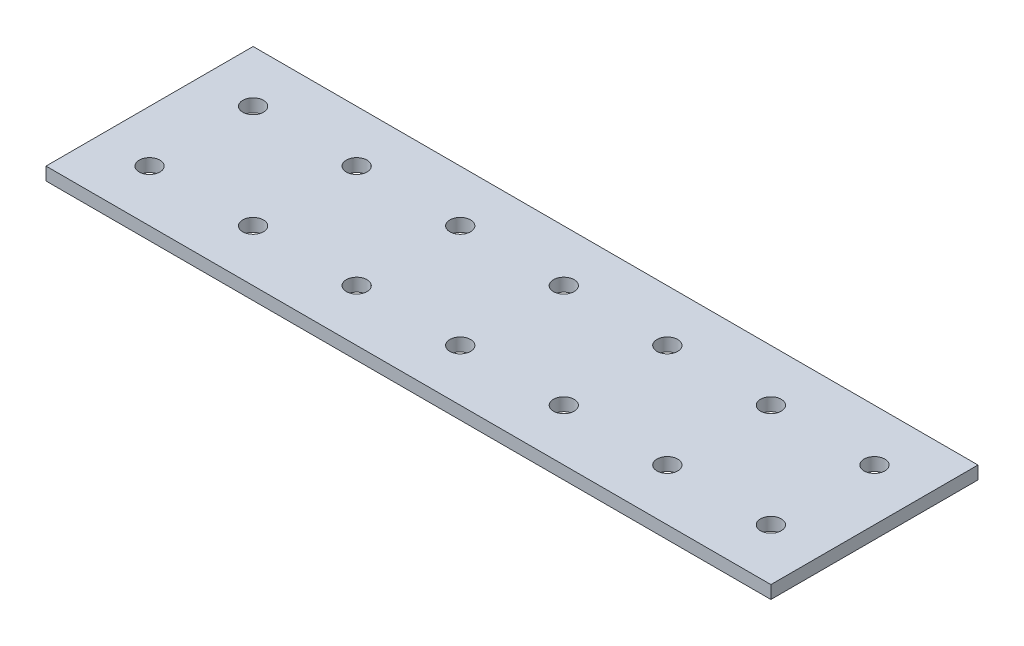
ISO-10303-21;
HEADER;
FILE_DESCRIPTION(('STEP AP214'),'2;1');
FILE_NAME('part.step','',(''),(''),'','','');
FILE_SCHEMA(('AUTOMOTIVE_DESIGN { 1 0 10303 214 1 1 1 1 }'));
ENDSEC;
DATA;
#1=APPLICATION_CONTEXT('core data for automotive mechanical design processes');
#2=APPLICATION_PROTOCOL_DEFINITION('international standard','automotive_design',2000,#1);
#3=PRODUCT_CONTEXT('',#1,'mechanical');
#4=PRODUCT('Part','Part','',(#3));
#5=PRODUCT_RELATED_PRODUCT_CATEGORY('part','',(#4));
#6=PRODUCT_DEFINITION_FORMATION('','',#4);
#7=PRODUCT_DEFINITION_CONTEXT('part definition',#1,'design');
#8=PRODUCT_DEFINITION('design','',#6,#7);
#9=PRODUCT_DEFINITION_SHAPE('','',#8);
#10=(LENGTH_UNIT() NAMED_UNIT(*) SI_UNIT(.MILLI.,.METRE.));
#11=(NAMED_UNIT(*) PLANE_ANGLE_UNIT() SI_UNIT($,.RADIAN.));
#12=(NAMED_UNIT(*) SI_UNIT($,.STERADIAN.) SOLID_ANGLE_UNIT());
#13=UNCERTAINTY_MEASURE_WITH_UNIT(LENGTH_MEASURE(1.E-05),#10,'distance_accuracy_value','');
#14=(GEOMETRIC_REPRESENTATION_CONTEXT(3) GLOBAL_UNCERTAINTY_ASSIGNED_CONTEXT((#13)) GLOBAL_UNIT_ASSIGNED_CONTEXT((#10,
#11,#12)) REPRESENTATION_CONTEXT('',''));
#15=CARTESIAN_POINT('',(0.,0.,0.));
#16=DIRECTION('',(0.,0.,1.));
#17=DIRECTION('',(1.,0.,0.));
#18=AXIS2_PLACEMENT_3D('',#15,#16,#17);
#19=CARTESIAN_POINT('',(0.,3.175,0.));
#20=DIRECTION('',(0.,-1.,0.));
#21=DIRECTION('',(0.,0.,-1.));
#22=AXIS2_PLACEMENT_3D('',#19,#20,#21);
#23=PLANE('',#22);
#24=DIRECTION('',(0.,0.,-1.));
#25=VECTOR('',#24,1.);
#26=CARTESIAN_POINT('',(88.9,3.175,25.4));
#27=LINE('',#26,#25);
#28=CARTESIAN_POINT('',(88.9,3.175,25.4));
#29=VERTEX_POINT('',#28);
#30=CARTESIAN_POINT('',(88.9,3.175,-25.4));
#31=VERTEX_POINT('',#30);
#32=EDGE_CURVE('E95',#29,#31,#27,.T.);
#33=ORIENTED_EDGE('',*,*,#32,.T.);
#34=DIRECTION('',(-1.,0.,0.));
#35=VECTOR('',#34,1.);
#36=CARTESIAN_POINT('',(-88.9,3.175,-25.4));
#37=LINE('',#36,#35);
#38=CARTESIAN_POINT('',(-88.9,3.175,-25.4));
#39=VERTEX_POINT('',#38);
#40=EDGE_CURVE('E90',#31,#39,#37,.T.);
#41=ORIENTED_EDGE('',*,*,#40,.T.);
#42=DIRECTION('',(0.,0.,1.));
#43=VECTOR('',#42,1.);
#44=CARTESIAN_POINT('',(-88.9,3.175,25.4));
#45=LINE('',#44,#43);
#46=CARTESIAN_POINT('',(-88.9,3.175,25.4));
#47=VERTEX_POINT('',#46);
#48=EDGE_CURVE('E93',#39,#47,#45,.T.);
#49=ORIENTED_EDGE('',*,*,#48,.T.);
#50=DIRECTION('',(1.,0.,0.));
#51=VECTOR('',#50,1.);
#52=CARTESIAN_POINT('',(-88.9,3.175,25.4));
#53=LINE('',#52,#51);
#54=EDGE_CURVE('E60',#47,#29,#53,.T.);
#55=ORIENTED_EDGE('',*,*,#54,.T.);
#56=EDGE_LOOP('',(#33,#41,#49,#55));
#57=FACE_BOUND('',#56,.T.);
#58=CARTESIAN_POINT('',(-76.2,3.175,12.7));
#59=DIRECTION('',(0.,1.,0.));
#60=DIRECTION('',(0.,0.,1.));
#61=AXIS2_PLACEMENT_3D('',#58,#59,#60);
#62=CIRCLE('',#61,2.54);
#63=CARTESIAN_POINT('',(-76.2,3.175,15.24));
#64=VERTEX_POINT('',#63);
#65=EDGE_CURVE('E130',#64,#64,#62,.T.);
#66=ORIENTED_EDGE('',*,*,#65,.F.);
#67=EDGE_LOOP('',(#66));
#68=FACE_BOUND('',#67,.T.);
#69=CARTESIAN_POINT('',(-76.2,3.175,-12.7));
#70=DIRECTION('',(0.,1.,0.));
#71=DIRECTION('',(0.,0.,1.));
#72=AXIS2_PLACEMENT_3D('',#69,#70,#71);
#73=CIRCLE('',#72,2.54);
#74=CARTESIAN_POINT('',(-76.2,3.175,-10.16));
#75=VERTEX_POINT('',#74);
#76=EDGE_CURVE('E138',#75,#75,#73,.T.);
#77=ORIENTED_EDGE('',*,*,#76,.F.);
#78=EDGE_LOOP('',(#77));
#79=FACE_BOUND('',#78,.T.);
#80=CARTESIAN_POINT('',(50.7999999999999,3.175,12.7));
#81=DIRECTION('',(0.,1.,0.));
#82=DIRECTION('',(0.,0.,1.));
#83=AXIS2_PLACEMENT_3D('',#80,#81,#82);
#84=CIRCLE('',#83,2.54);
#85=CARTESIAN_POINT('',(50.7999999999999,3.175,15.24));
#86=VERTEX_POINT('',#85);
#87=EDGE_CURVE('E146',#86,#86,#84,.T.);
#88=ORIENTED_EDGE('',*,*,#87,.F.);
#89=EDGE_LOOP('',(#88));
#90=FACE_BOUND('',#89,.T.);
#91=CARTESIAN_POINT('',(-50.8,3.175,12.7));
#92=DIRECTION('',(0.,1.,0.));
#93=DIRECTION('',(0.,0.,1.));
#94=AXIS2_PLACEMENT_3D('',#91,#92,#93);
#95=CIRCLE('',#94,2.54);
#96=CARTESIAN_POINT('',(-50.8,3.175,15.24));
#97=VERTEX_POINT('',#96);
#98=EDGE_CURVE('E163',#97,#97,#95,.T.);
#99=ORIENTED_EDGE('',*,*,#98,.F.);
#100=EDGE_LOOP('',(#99));
#101=FACE_BOUND('',#100,.T.);
#102=CARTESIAN_POINT('',(-50.8,3.175,-12.7));
#103=DIRECTION('',(0.,1.,0.));
#104=DIRECTION('',(0.,0.,1.));
#105=AXIS2_PLACEMENT_3D('',#102,#103,#104);
#106=CIRCLE('',#105,2.54);
#107=CARTESIAN_POINT('',(-50.8,3.175,-10.16));
#108=VERTEX_POINT('',#107);
#109=EDGE_CURVE('E160',#108,#108,#106,.T.);
#110=ORIENTED_EDGE('',*,*,#109,.F.);
#111=EDGE_LOOP('',(#110));
#112=FACE_BOUND('',#111,.T.);
#113=CARTESIAN_POINT('',(-25.4,3.175,12.7));
#114=DIRECTION('',(0.,1.,0.));
#115=DIRECTION('',(0.,0.,1.));
#116=AXIS2_PLACEMENT_3D('',#113,#114,#115);
#117=CIRCLE('',#116,2.54);
#118=CARTESIAN_POINT('',(-25.4,3.175,15.24));
#119=VERTEX_POINT('',#118);
#120=EDGE_CURVE('E161',#119,#119,#117,.T.);
#121=ORIENTED_EDGE('',*,*,#120,.F.);
#122=EDGE_LOOP('',(#121));
#123=FACE_BOUND('',#122,.T.);
#124=CARTESIAN_POINT('',(-25.4,3.175,-12.7));
#125=DIRECTION('',(0.,1.,0.));
#126=DIRECTION('',(0.,0.,1.));
#127=AXIS2_PLACEMENT_3D('',#124,#125,#126);
#128=CIRCLE('',#127,2.54);
#129=CARTESIAN_POINT('',(-25.4,3.175,-10.16));
#130=VERTEX_POINT('',#129);
#131=EDGE_CURVE('E181',#130,#130,#128,.T.);
#132=ORIENTED_EDGE('',*,*,#131,.F.);
#133=EDGE_LOOP('',(#132));
#134=FACE_BOUND('',#133,.T.);
#135=CARTESIAN_POINT('',(0.,3.175,12.7));
#136=DIRECTION('',(0.,1.,0.));
#137=DIRECTION('',(0.,0.,1.));
#138=AXIS2_PLACEMENT_3D('',#135,#136,#137);
#139=CIRCLE('',#138,2.54);
#140=CARTESIAN_POINT('',(0.,3.175,15.24));
#141=VERTEX_POINT('',#140);
#142=EDGE_CURVE('E188',#141,#141,#139,.T.);
#143=ORIENTED_EDGE('',*,*,#142,.F.);
#144=EDGE_LOOP('',(#143));
#145=FACE_BOUND('',#144,.T.);
#146=CARTESIAN_POINT('',(0.,3.175,-12.7));
#147=DIRECTION('',(0.,1.,0.));
#148=DIRECTION('',(0.,0.,1.));
#149=AXIS2_PLACEMENT_3D('',#146,#147,#148);
#150=CIRCLE('',#149,2.54);
#151=CARTESIAN_POINT('',(0.,3.175,-10.16));
#152=VERTEX_POINT('',#151);
#153=EDGE_CURVE('E195',#152,#152,#150,.T.);
#154=ORIENTED_EDGE('',*,*,#153,.F.);
#155=EDGE_LOOP('',(#154));
#156=FACE_BOUND('',#155,.T.);
#157=CARTESIAN_POINT('',(25.3999999999999,3.175,12.7));
#158=DIRECTION('',(0.,1.,0.));
#159=DIRECTION('',(0.,0.,1.));
#160=AXIS2_PLACEMENT_3D('',#157,#158,#159);
#161=CIRCLE('',#160,2.54);
#162=CARTESIAN_POINT('',(25.3999999999999,3.175,15.24));
#163=VERTEX_POINT('',#162);
#164=EDGE_CURVE('E203',#163,#163,#161,.T.);
#165=ORIENTED_EDGE('',*,*,#164,.F.);
#166=EDGE_LOOP('',(#165));
#167=FACE_BOUND('',#166,.T.);
#168=CARTESIAN_POINT('',(25.3999999999999,3.175,-12.7));
#169=DIRECTION('',(0.,1.,0.));
#170=DIRECTION('',(0.,0.,1.));
#171=AXIS2_PLACEMENT_3D('',#168,#169,#170);
#172=CIRCLE('',#171,2.54);
#173=CARTESIAN_POINT('',(25.3999999999999,3.175,-10.16));
#174=VERTEX_POINT('',#173);
#175=EDGE_CURVE('E213',#174,#174,#172,.T.);
#176=ORIENTED_EDGE('',*,*,#175,.F.);
#177=EDGE_LOOP('',(#176));
#178=FACE_BOUND('',#177,.T.);
#179=CARTESIAN_POINT('',(50.7999999999999,3.175,-12.7));
#180=DIRECTION('',(0.,1.,0.));
#181=DIRECTION('',(0.,0.,1.));
#182=AXIS2_PLACEMENT_3D('',#179,#180,#181);
#183=CIRCLE('',#182,2.54);
#184=CARTESIAN_POINT('',(50.7999999999999,3.175,-10.16));
#185=VERTEX_POINT('',#184);
#186=EDGE_CURVE('E214',#185,#185,#183,.T.);
#187=ORIENTED_EDGE('',*,*,#186,.F.);
#188=EDGE_LOOP('',(#187));
#189=FACE_BOUND('',#188,.T.);
#190=CARTESIAN_POINT('',(76.1999999999999,3.175,12.7));
#191=DIRECTION('',(0.,1.,0.));
#192=DIRECTION('',(0.,0.,1.));
#193=AXIS2_PLACEMENT_3D('',#190,#191,#192);
#194=CIRCLE('',#193,2.54);
#195=CARTESIAN_POINT('',(76.1999999999999,3.175,15.24));
#196=VERTEX_POINT('',#195);
#197=EDGE_CURVE('E238',#196,#196,#194,.T.);
#198=ORIENTED_EDGE('',*,*,#197,.F.);
#199=EDGE_LOOP('',(#198));
#200=FACE_BOUND('',#199,.T.);
#201=CARTESIAN_POINT('',(76.1999999999999,3.175,-12.7));
#202=DIRECTION('',(0.,1.,0.));
#203=DIRECTION('',(0.,0.,1.));
#204=AXIS2_PLACEMENT_3D('',#201,#202,#203);
#205=CIRCLE('',#204,2.54);
#206=CARTESIAN_POINT('',(76.1999999999999,3.175,-10.16));
#207=VERTEX_POINT('',#206);
#208=EDGE_CURVE('E241',#207,#207,#205,.T.);
#209=ORIENTED_EDGE('',*,*,#208,.F.);
#210=EDGE_LOOP('',(#209));
#211=FACE_BOUND('',#210,.T.);
#212=ADVANCED_FACE('F43',(#57,#68,#79,#90,#101,#112,#123,#134,#145,#156,#167,#178,#189,#200,
#211),#23,.F.);
#213=CARTESIAN_POINT('',(0.,0.,0.));
#214=DIRECTION('',(0.,-1.,0.));
#215=DIRECTION('',(0.,0.,-1.));
#216=AXIS2_PLACEMENT_3D('',#213,#214,#215);
#217=PLANE('',#216);
#218=CARTESIAN_POINT('',(76.1999999999999,0.,12.7));
#219=DIRECTION('',(0.,1.,0.));
#220=DIRECTION('',(0.,0.,1.));
#221=AXIS2_PLACEMENT_3D('',#218,#219,#220);
#222=CIRCLE('',#221,2.54);
#223=CARTESIAN_POINT('',(76.1999999999999,0.,15.24));
#224=VERTEX_POINT('',#223);
#225=EDGE_CURVE('E243',#224,#224,#222,.T.);
#226=ORIENTED_EDGE('',*,*,#225,.T.);
#227=EDGE_LOOP('',(#226));
#228=FACE_BOUND('',#227,.T.);
#229=CARTESIAN_POINT('',(25.3999999999999,0.,-12.7));
#230=DIRECTION('',(0.,1.,0.));
#231=DIRECTION('',(0.,0.,1.));
#232=AXIS2_PLACEMENT_3D('',#229,#230,#231);
#233=CIRCLE('',#232,2.54);
#234=CARTESIAN_POINT('',(25.3999999999999,0.,-10.16));
#235=VERTEX_POINT('',#234);
#236=EDGE_CURVE('E207',#235,#235,#233,.T.);
#237=ORIENTED_EDGE('',*,*,#236,.T.);
#238=EDGE_LOOP('',(#237));
#239=FACE_BOUND('',#238,.T.);
#240=CARTESIAN_POINT('',(0.,0.,-12.7));
#241=DIRECTION('',(0.,1.,0.));
#242=DIRECTION('',(0.,0.,1.));
#243=AXIS2_PLACEMENT_3D('',#240,#241,#242);
#244=CIRCLE('',#243,2.54);
#245=CARTESIAN_POINT('',(0.,0.,-10.16));
#246=VERTEX_POINT('',#245);
#247=EDGE_CURVE('E198',#246,#246,#244,.T.);
#248=ORIENTED_EDGE('',*,*,#247,.T.);
#249=EDGE_LOOP('',(#248));
#250=FACE_BOUND('',#249,.T.);
#251=CARTESIAN_POINT('',(-25.4,0.,-12.7));
#252=DIRECTION('',(0.,1.,0.));
#253=DIRECTION('',(0.,0.,1.));
#254=AXIS2_PLACEMENT_3D('',#251,#252,#253);
#255=CIRCLE('',#254,2.54);
#256=CARTESIAN_POINT('',(-25.4,0.,-10.16));
#257=VERTEX_POINT('',#256);
#258=EDGE_CURVE('E183',#257,#257,#255,.T.);
#259=ORIENTED_EDGE('',*,*,#258,.T.);
#260=EDGE_LOOP('',(#259));
#261=FACE_BOUND('',#260,.T.);
#262=CARTESIAN_POINT('',(-50.8,0.,-12.7));
#263=DIRECTION('',(0.,1.,0.));
#264=DIRECTION('',(0.,0.,1.));
#265=AXIS2_PLACEMENT_3D('',#262,#263,#264);
#266=CIRCLE('',#265,2.54);
#267=CARTESIAN_POINT('',(-50.8,0.,-10.16));
#268=VERTEX_POINT('',#267);
#269=EDGE_CURVE('E154',#268,#268,#266,.T.);
#270=ORIENTED_EDGE('',*,*,#269,.T.);
#271=EDGE_LOOP('',(#270));
#272=FACE_BOUND('',#271,.T.);
#273=CARTESIAN_POINT('',(50.7999999999999,0.,12.7));
#274=DIRECTION('',(0.,1.,0.));
#275=DIRECTION('',(0.,0.,1.));
#276=AXIS2_PLACEMENT_3D('',#273,#274,#275);
#277=CIRCLE('',#276,2.54);
#278=CARTESIAN_POINT('',(50.7999999999999,0.,15.24));
#279=VERTEX_POINT('',#278);
#280=EDGE_CURVE('E166',#279,#279,#277,.T.);
#281=ORIENTED_EDGE('',*,*,#280,.T.);
#282=EDGE_LOOP('',(#281));
#283=FACE_BOUND('',#282,.T.);
#284=CARTESIAN_POINT('',(-76.2,0.,12.7));
#285=DIRECTION('',(0.,1.,0.));
#286=DIRECTION('',(0.,0.,1.));
#287=AXIS2_PLACEMENT_3D('',#284,#285,#286);
#288=CIRCLE('',#287,2.54);
#289=CARTESIAN_POINT('',(-76.2,0.,15.24));
#290=VERTEX_POINT('',#289);
#291=EDGE_CURVE('E132',#290,#290,#288,.T.);
#292=ORIENTED_EDGE('',*,*,#291,.T.);
#293=EDGE_LOOP('',(#292));
#294=FACE_BOUND('',#293,.T.);
#295=DIRECTION('',(0.,0.,-1.));
#296=VECTOR('',#295,1.);
#297=CARTESIAN_POINT('',(88.9,0.,25.4));
#298=LINE('',#297,#296);
#299=CARTESIAN_POINT('',(88.9,0.,25.4));
#300=VERTEX_POINT('',#299);
#301=CARTESIAN_POINT('',(88.9,0.,-25.4));
#302=VERTEX_POINT('',#301);
#303=EDGE_CURVE('E111',#300,#302,#298,.T.);
#304=ORIENTED_EDGE('',*,*,#303,.F.);
#305=DIRECTION('',(1.,0.,0.));
#306=VECTOR('',#305,1.);
#307=CARTESIAN_POINT('',(-88.9,0.,25.4));
#308=LINE('',#307,#306);
#309=CARTESIAN_POINT('',(-88.9,0.,25.4));
#310=VERTEX_POINT('',#309);
#311=EDGE_CURVE('E83',#310,#300,#308,.T.);
#312=ORIENTED_EDGE('',*,*,#311,.F.);
#313=DIRECTION('',(0.,0.,1.));
#314=VECTOR('',#313,1.);
#315=CARTESIAN_POINT('',(-88.9,0.,25.4));
#316=LINE('',#315,#314);
#317=CARTESIAN_POINT('',(-88.9,0.,-25.4));
#318=VERTEX_POINT('',#317);
#319=EDGE_CURVE('E77',#318,#310,#316,.T.);
#320=ORIENTED_EDGE('',*,*,#319,.F.);
#321=DIRECTION('',(-1.,0.,0.));
#322=VECTOR('',#321,1.);
#323=CARTESIAN_POINT('',(-88.9,0.,-25.4));
#324=LINE('',#323,#322);
#325=EDGE_CURVE('E99',#302,#318,#324,.T.);
#326=ORIENTED_EDGE('',*,*,#325,.F.);
#327=EDGE_LOOP('',(#304,#312,#320,#326));
#328=FACE_BOUND('',#327,.T.);
#329=CARTESIAN_POINT('',(-76.2,0.,-12.7));
#330=DIRECTION('',(0.,1.,0.));
#331=DIRECTION('',(0.,0.,1.));
#332=AXIS2_PLACEMENT_3D('',#329,#330,#331);
#333=CIRCLE('',#332,2.54);
#334=CARTESIAN_POINT('',(-76.2,0.,-10.16));
#335=VERTEX_POINT('',#334);
#336=EDGE_CURVE('E140',#335,#335,#333,.T.);
#337=ORIENTED_EDGE('',*,*,#336,.T.);
#338=EDGE_LOOP('',(#337));
#339=FACE_BOUND('',#338,.T.);
#340=CARTESIAN_POINT('',(-50.8,0.,12.7));
#341=DIRECTION('',(0.,1.,0.));
#342=DIRECTION('',(0.,0.,1.));
#343=AXIS2_PLACEMENT_3D('',#340,#341,#342);
#344=CIRCLE('',#343,2.54);
#345=CARTESIAN_POINT('',(-50.8,0.,15.24));
#346=VERTEX_POINT('',#345);
#347=EDGE_CURVE('E167',#346,#346,#344,.T.);
#348=ORIENTED_EDGE('',*,*,#347,.T.);
#349=EDGE_LOOP('',(#348));
#350=FACE_BOUND('',#349,.T.);
#351=CARTESIAN_POINT('',(-25.4,0.,12.7));
#352=DIRECTION('',(0.,1.,0.));
#353=DIRECTION('',(0.,0.,1.));
#354=AXIS2_PLACEMENT_3D('',#351,#352,#353);
#355=CIRCLE('',#354,2.54);
#356=CARTESIAN_POINT('',(-25.4,0.,15.24));
#357=VERTEX_POINT('',#356);
#358=EDGE_CURVE('E176',#357,#357,#355,.T.);
#359=ORIENTED_EDGE('',*,*,#358,.T.);
#360=EDGE_LOOP('',(#359));
#361=FACE_BOUND('',#360,.T.);
#362=CARTESIAN_POINT('',(0.,0.,12.7));
#363=DIRECTION('',(0.,1.,0.));
#364=DIRECTION('',(0.,0.,1.));
#365=AXIS2_PLACEMENT_3D('',#362,#363,#364);
#366=CIRCLE('',#365,2.54);
#367=CARTESIAN_POINT('',(0.,0.,15.24));
#368=VERTEX_POINT('',#367);
#369=EDGE_CURVE('E190',#368,#368,#366,.T.);
#370=ORIENTED_EDGE('',*,*,#369,.T.);
#371=EDGE_LOOP('',(#370));
#372=FACE_BOUND('',#371,.T.);
#373=CARTESIAN_POINT('',(25.3999999999999,0.,12.7));
#374=DIRECTION('',(0.,1.,0.));
#375=DIRECTION('',(0.,0.,1.));
#376=AXIS2_PLACEMENT_3D('',#373,#374,#375);
#377=CIRCLE('',#376,2.54);
#378=CARTESIAN_POINT('',(25.3999999999999,0.,15.24));
#379=VERTEX_POINT('',#378);
#380=EDGE_CURVE('E217',#379,#379,#377,.T.);
#381=ORIENTED_EDGE('',*,*,#380,.T.);
#382=EDGE_LOOP('',(#381));
#383=FACE_BOUND('',#382,.T.);
#384=CARTESIAN_POINT('',(50.7999999999999,0.,-12.7));
#385=DIRECTION('',(0.,1.,0.));
#386=DIRECTION('',(0.,0.,1.));
#387=AXIS2_PLACEMENT_3D('',#384,#385,#386);
#388=CIRCLE('',#387,2.54);
#389=CARTESIAN_POINT('',(50.7999999999999,0.,-10.16));
#390=VERTEX_POINT('',#389);
#391=EDGE_CURVE('E253',#390,#390,#388,.T.);
#392=ORIENTED_EDGE('',*,*,#391,.T.);
#393=EDGE_LOOP('',(#392));
#394=FACE_BOUND('',#393,.T.);
#395=CARTESIAN_POINT('',(76.1999999999999,0.,-12.7));
#396=DIRECTION('',(0.,1.,0.));
#397=DIRECTION('',(0.,0.,1.));
#398=AXIS2_PLACEMENT_3D('',#395,#396,#397);
#399=CIRCLE('',#398,2.54);
#400=CARTESIAN_POINT('',(76.1999999999999,0.,-10.16));
#401=VERTEX_POINT('',#400);
#402=EDGE_CURVE('E244',#401,#401,#399,.T.);
#403=ORIENTED_EDGE('',*,*,#402,.T.);
#404=EDGE_LOOP('',(#403));
#405=FACE_BOUND('',#404,.T.);
#406=ADVANCED_FACE('F126',(#228,#239,#250,#261,#272,#283,#294,#328,#339,#350,#361,#372,#383,
#394,#405),#217,.T.);
#407=CARTESIAN_POINT('',(88.9,3.175,25.4));
#408=DIRECTION('',(-1.,0.,0.));
#409=DIRECTION('',(0.,0.,1.));
#410=AXIS2_PLACEMENT_3D('',#407,#408,#409);
#411=PLANE('',#410);
#412=ORIENTED_EDGE('',*,*,#303,.T.);
#413=DIRECTION('',(0.,-1.,0.));
#414=VECTOR('',#413,1.);
#415=CARTESIAN_POINT('',(88.9,3.175,-25.4));
#416=LINE('',#415,#414);
#417=EDGE_CURVE('E12',#31,#302,#416,.T.);
#418=ORIENTED_EDGE('',*,*,#417,.F.);
#419=ORIENTED_EDGE('',*,*,#32,.F.);
#420=DIRECTION('',(0.,-1.,0.));
#421=VECTOR('',#420,1.);
#422=CARTESIAN_POINT('',(88.9,3.175,25.4));
#423=LINE('',#422,#421);
#424=EDGE_CURVE('E105',#29,#300,#423,.T.);
#425=ORIENTED_EDGE('',*,*,#424,.T.);
#426=EDGE_LOOP('',(#412,#418,#419,#425));
#427=FACE_BOUND('',#426,.T.);
#428=ADVANCED_FACE('F45',(#427),#411,.F.);
#429=CARTESIAN_POINT('',(-88.9,3.175,-25.4));
#430=DIRECTION('',(0.,0.,1.));
#431=DIRECTION('',(1.,0.,0.));
#432=AXIS2_PLACEMENT_3D('',#429,#430,#431);
#433=PLANE('',#432);
#434=ORIENTED_EDGE('',*,*,#325,.T.);
#435=DIRECTION('',(0.,-1.,0.));
#436=VECTOR('',#435,1.);
#437=CARTESIAN_POINT('',(-88.9,3.175,-25.4));
#438=LINE('',#437,#436);
#439=EDGE_CURVE('E52',#39,#318,#438,.T.);
#440=ORIENTED_EDGE('',*,*,#439,.F.);
#441=ORIENTED_EDGE('',*,*,#40,.F.);
#442=ORIENTED_EDGE('',*,*,#417,.T.);
#443=EDGE_LOOP('',(#434,#440,#441,#442));
#444=FACE_BOUND('',#443,.T.);
#445=ADVANCED_FACE('F98',(#444),#433,.F.);
#446=CARTESIAN_POINT('',(-88.9,3.175,25.4));
#447=DIRECTION('',(1.,0.,0.));
#448=DIRECTION('',(0.,0.,-1.));
#449=AXIS2_PLACEMENT_3D('',#446,#447,#448);
#450=PLANE('',#449);
#451=ORIENTED_EDGE('',*,*,#319,.T.);
#452=DIRECTION('',(0.,-1.,0.));
#453=VECTOR('',#452,1.);
#454=CARTESIAN_POINT('',(-88.9,3.175,25.4));
#455=LINE('',#454,#453);
#456=EDGE_CURVE('E100',#47,#310,#455,.T.);
#457=ORIENTED_EDGE('',*,*,#456,.F.);
#458=ORIENTED_EDGE('',*,*,#48,.F.);
#459=ORIENTED_EDGE('',*,*,#439,.T.);
#460=EDGE_LOOP('',(#451,#457,#458,#459));
#461=FACE_BOUND('',#460,.T.);
#462=ADVANCED_FACE('F101',(#461),#450,.F.);
#463=CARTESIAN_POINT('',(-88.9,3.175,25.4));
#464=DIRECTION('',(0.,0.,-1.));
#465=DIRECTION('',(-1.,0.,0.));
#466=AXIS2_PLACEMENT_3D('',#463,#464,#465);
#467=PLANE('',#466);
#468=ORIENTED_EDGE('',*,*,#311,.T.);
#469=ORIENTED_EDGE('',*,*,#424,.F.);
#470=ORIENTED_EDGE('',*,*,#54,.F.);
#471=ORIENTED_EDGE('',*,*,#456,.T.);
#472=EDGE_LOOP('',(#468,#469,#470,#471));
#473=FACE_BOUND('',#472,.T.);
#474=ADVANCED_FACE('F123',(#473),#467,.F.);
#475=CARTESIAN_POINT('',(-76.2,3.175,12.7));
#476=DIRECTION('',(0.,-1.,0.));
#477=DIRECTION('',(0.,0.,-1.));
#478=AXIS2_PLACEMENT_3D('',#475,#476,#477);
#479=CYLINDRICAL_SURFACE('',#478,2.54);
#480=ORIENTED_EDGE('',*,*,#65,.T.);
#481=EDGE_LOOP('',(#480));
#482=FACE_BOUND('',#481,.T.);
#483=ORIENTED_EDGE('',*,*,#291,.F.);
#484=EDGE_LOOP('',(#483));
#485=FACE_BOUND('',#484,.T.);
#486=ADVANCED_FACE('F310',(#482,#485),#479,.F.);
#487=CARTESIAN_POINT('',(-76.2,3.175,-12.7));
#488=DIRECTION('',(0.,-1.,0.));
#489=DIRECTION('',(0.,0.,-1.));
#490=AXIS2_PLACEMENT_3D('',#487,#488,#489);
#491=CYLINDRICAL_SURFACE('',#490,2.54);
#492=ORIENTED_EDGE('',*,*,#76,.T.);
#493=EDGE_LOOP('',(#492));
#494=FACE_BOUND('',#493,.T.);
#495=ORIENTED_EDGE('',*,*,#336,.F.);
#496=EDGE_LOOP('',(#495));
#497=FACE_BOUND('',#496,.T.);
#498=ADVANCED_FACE('F306',(#494,#497),#491,.F.);
#499=CARTESIAN_POINT('',(50.7999999999999,3.175,12.7));
#500=DIRECTION('',(0.,-1.,0.));
#501=DIRECTION('',(0.,0.,-1.));
#502=AXIS2_PLACEMENT_3D('',#499,#500,#501);
#503=CYLINDRICAL_SURFACE('',#502,2.54);
#504=ORIENTED_EDGE('',*,*,#87,.T.);
#505=EDGE_LOOP('',(#504));
#506=FACE_BOUND('',#505,.T.);
#507=ORIENTED_EDGE('',*,*,#280,.F.);
#508=EDGE_LOOP('',(#507));
#509=FACE_BOUND('',#508,.T.);
#510=ADVANCED_FACE('F302',(#506,#509),#503,.F.);
#511=CARTESIAN_POINT('',(-50.8,3.175,12.7));
#512=DIRECTION('',(0.,-1.,0.));
#513=DIRECTION('',(0.,0.,-1.));
#514=AXIS2_PLACEMENT_3D('',#511,#512,#513);
#515=CYLINDRICAL_SURFACE('',#514,2.54);
#516=ORIENTED_EDGE('',*,*,#98,.T.);
#517=EDGE_LOOP('',(#516));
#518=FACE_BOUND('',#517,.T.);
#519=ORIENTED_EDGE('',*,*,#347,.F.);
#520=EDGE_LOOP('',(#519));
#521=FACE_BOUND('',#520,.T.);
#522=ADVANCED_FACE('F298',(#518,#521),#515,.F.);
#523=CARTESIAN_POINT('',(-50.8,3.175,-12.7));
#524=DIRECTION('',(0.,-1.,0.));
#525=DIRECTION('',(0.,0.,-1.));
#526=AXIS2_PLACEMENT_3D('',#523,#524,#525);
#527=CYLINDRICAL_SURFACE('',#526,2.54);
#528=ORIENTED_EDGE('',*,*,#109,.T.);
#529=EDGE_LOOP('',(#528));
#530=FACE_BOUND('',#529,.T.);
#531=ORIENTED_EDGE('',*,*,#269,.F.);
#532=EDGE_LOOP('',(#531));
#533=FACE_BOUND('',#532,.T.);
#534=ADVANCED_FACE('F294',(#530,#533),#527,.F.);
#535=CARTESIAN_POINT('',(-25.4,3.175,12.7));
#536=DIRECTION('',(0.,-1.,0.));
#537=DIRECTION('',(0.,0.,-1.));
#538=AXIS2_PLACEMENT_3D('',#535,#536,#537);
#539=CYLINDRICAL_SURFACE('',#538,2.54);
#540=ORIENTED_EDGE('',*,*,#120,.T.);
#541=EDGE_LOOP('',(#540));
#542=FACE_BOUND('',#541,.T.);
#543=ORIENTED_EDGE('',*,*,#358,.F.);
#544=EDGE_LOOP('',(#543));
#545=FACE_BOUND('',#544,.T.);
#546=ADVANCED_FACE('F290',(#542,#545),#539,.F.);
#547=CARTESIAN_POINT('',(-25.4,3.175,-12.7));
#548=DIRECTION('',(0.,-1.,0.));
#549=DIRECTION('',(0.,0.,-1.));
#550=AXIS2_PLACEMENT_3D('',#547,#548,#549);
#551=CYLINDRICAL_SURFACE('',#550,2.54);
#552=ORIENTED_EDGE('',*,*,#131,.T.);
#553=EDGE_LOOP('',(#552));
#554=FACE_BOUND('',#553,.T.);
#555=ORIENTED_EDGE('',*,*,#258,.F.);
#556=EDGE_LOOP('',(#555));
#557=FACE_BOUND('',#556,.T.);
#558=ADVANCED_FACE('F286',(#554,#557),#551,.F.);
#559=CARTESIAN_POINT('',(0.,3.175,12.7));
#560=DIRECTION('',(0.,-1.,0.));
#561=DIRECTION('',(0.,0.,-1.));
#562=AXIS2_PLACEMENT_3D('',#559,#560,#561);
#563=CYLINDRICAL_SURFACE('',#562,2.54);
#564=ORIENTED_EDGE('',*,*,#142,.T.);
#565=EDGE_LOOP('',(#564));
#566=FACE_BOUND('',#565,.T.);
#567=ORIENTED_EDGE('',*,*,#369,.F.);
#568=EDGE_LOOP('',(#567));
#569=FACE_BOUND('',#568,.T.);
#570=ADVANCED_FACE('F282',(#566,#569),#563,.F.);
#571=CARTESIAN_POINT('',(0.,3.175,-12.7));
#572=DIRECTION('',(0.,-1.,0.));
#573=DIRECTION('',(0.,0.,-1.));
#574=AXIS2_PLACEMENT_3D('',#571,#572,#573);
#575=CYLINDRICAL_SURFACE('',#574,2.54);
#576=ORIENTED_EDGE('',*,*,#153,.T.);
#577=EDGE_LOOP('',(#576));
#578=FACE_BOUND('',#577,.T.);
#579=ORIENTED_EDGE('',*,*,#247,.F.);
#580=EDGE_LOOP('',(#579));
#581=FACE_BOUND('',#580,.T.);
#582=ADVANCED_FACE('F278',(#578,#581),#575,.F.);
#583=CARTESIAN_POINT('',(25.3999999999999,3.175,12.7));
#584=DIRECTION('',(0.,-1.,0.));
#585=DIRECTION('',(0.,0.,-1.));
#586=AXIS2_PLACEMENT_3D('',#583,#584,#585);
#587=CYLINDRICAL_SURFACE('',#586,2.54);
#588=ORIENTED_EDGE('',*,*,#164,.T.);
#589=EDGE_LOOP('',(#588));
#590=FACE_BOUND('',#589,.T.);
#591=ORIENTED_EDGE('',*,*,#380,.F.);
#592=EDGE_LOOP('',(#591));
#593=FACE_BOUND('',#592,.T.);
#594=ADVANCED_FACE('F272',(#590,#593),#587,.F.);
#595=CARTESIAN_POINT('',(25.3999999999999,3.175,-12.7));
#596=DIRECTION('',(0.,-1.,0.));
#597=DIRECTION('',(0.,0.,-1.));
#598=AXIS2_PLACEMENT_3D('',#595,#596,#597);
#599=CYLINDRICAL_SURFACE('',#598,2.54);
#600=ORIENTED_EDGE('',*,*,#175,.T.);
#601=EDGE_LOOP('',(#600));
#602=FACE_BOUND('',#601,.T.);
#603=ORIENTED_EDGE('',*,*,#236,.F.);
#604=EDGE_LOOP('',(#603));
#605=FACE_BOUND('',#604,.T.);
#606=ADVANCED_FACE('F226',(#602,#605),#599,.F.);
#607=CARTESIAN_POINT('',(50.7999999999999,3.175,-12.7));
#608=DIRECTION('',(0.,-1.,0.));
#609=DIRECTION('',(0.,0.,-1.));
#610=AXIS2_PLACEMENT_3D('',#607,#608,#609);
#611=CYLINDRICAL_SURFACE('',#610,2.54);
#612=ORIENTED_EDGE('',*,*,#186,.T.);
#613=EDGE_LOOP('',(#612));
#614=FACE_BOUND('',#613,.T.);
#615=ORIENTED_EDGE('',*,*,#391,.F.);
#616=EDGE_LOOP('',(#615));
#617=FACE_BOUND('',#616,.T.);
#618=ADVANCED_FACE('F260',(#614,#617),#611,.F.);
#619=CARTESIAN_POINT('',(76.1999999999999,3.175,12.7));
#620=DIRECTION('',(0.,-1.,0.));
#621=DIRECTION('',(0.,0.,-1.));
#622=AXIS2_PLACEMENT_3D('',#619,#620,#621);
#623=CYLINDRICAL_SURFACE('',#622,2.54);
#624=ORIENTED_EDGE('',*,*,#197,.T.);
#625=EDGE_LOOP('',(#624));
#626=FACE_BOUND('',#625,.T.);
#627=ORIENTED_EDGE('',*,*,#225,.F.);
#628=EDGE_LOOP('',(#627));
#629=FACE_BOUND('',#628,.T.);
#630=ADVANCED_FACE('F262',(#626,#629),#623,.F.);
#631=CARTESIAN_POINT('',(76.1999999999999,3.175,-12.7));
#632=DIRECTION('',(0.,-1.,0.));
#633=DIRECTION('',(0.,0.,-1.));
#634=AXIS2_PLACEMENT_3D('',#631,#632,#633);
#635=CYLINDRICAL_SURFACE('',#634,2.54);
#636=ORIENTED_EDGE('',*,*,#208,.T.);
#637=EDGE_LOOP('',(#636));
#638=FACE_BOUND('',#637,.T.);
#639=ORIENTED_EDGE('',*,*,#402,.F.);
#640=EDGE_LOOP('',(#639));
#641=FACE_BOUND('',#640,.T.);
#642=ADVANCED_FACE('F269',(#638,#641),#635,.F.);
#643=CLOSED_SHELL('',(#212,#406,#428,#445,#462,#474,#486,#498,#510,#522,#534,#546,#558,#570,
#582,#594,#606,#618,#630,#642));
#644=MANIFOLD_SOLID_BREP('B2',#643);
#645=ADVANCED_BREP_SHAPE_REPRESENTATION('',(#18,#644),#14);
#646=SHAPE_DEFINITION_REPRESENTATION(#9,#645);
ENDSEC;
END-ISO-10303-21;
